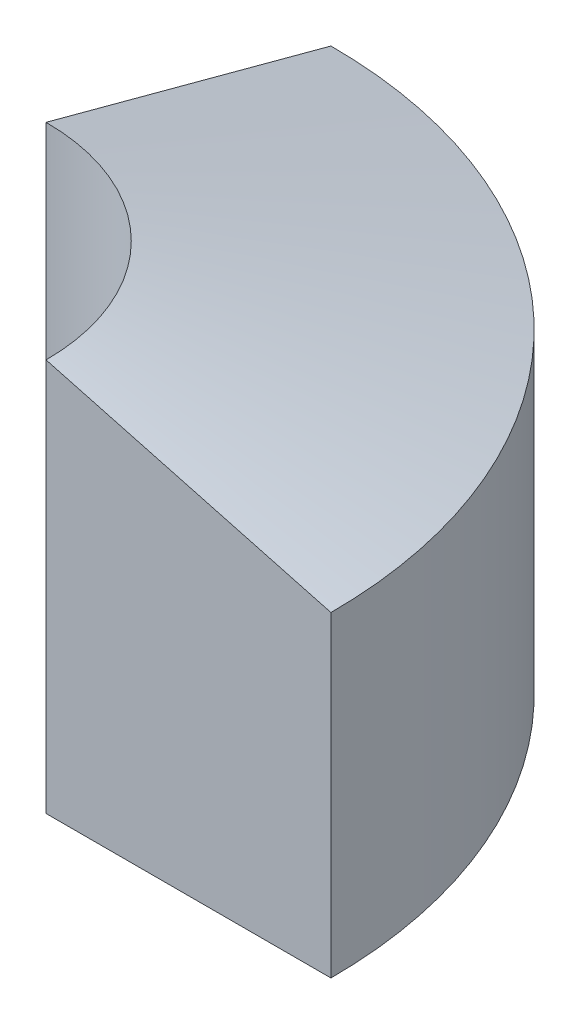
ISO-10303-21;
HEADER;
FILE_DESCRIPTION(('STEP AP214'),'2;1');
FILE_NAME('part.step','',(''),(''),'','','');
FILE_SCHEMA(('AUTOMOTIVE_DESIGN { 1 0 10303 214 1 1 1 1 }'));
ENDSEC;
DATA;
#1=APPLICATION_CONTEXT('core data for automotive mechanical design processes');
#2=APPLICATION_PROTOCOL_DEFINITION('international standard','automotive_design',2000,#1);
#3=PRODUCT_CONTEXT('',#1,'mechanical');
#4=PRODUCT('Part','Part','',(#3));
#5=PRODUCT_RELATED_PRODUCT_CATEGORY('part','',(#4));
#6=PRODUCT_DEFINITION_FORMATION('','',#4);
#7=PRODUCT_DEFINITION_CONTEXT('part definition',#1,'design');
#8=PRODUCT_DEFINITION('design','',#6,#7);
#9=PRODUCT_DEFINITION_SHAPE('','',#8);
#10=(LENGTH_UNIT() NAMED_UNIT(*) SI_UNIT(.MILLI.,.METRE.));
#11=(NAMED_UNIT(*) PLANE_ANGLE_UNIT() SI_UNIT($,.RADIAN.));
#12=(NAMED_UNIT(*) SI_UNIT($,.STERADIAN.) SOLID_ANGLE_UNIT());
#13=UNCERTAINTY_MEASURE_WITH_UNIT(LENGTH_MEASURE(1.E-05),#10,'distance_accuracy_value','');
#14=(GEOMETRIC_REPRESENTATION_CONTEXT(3) GLOBAL_UNCERTAINTY_ASSIGNED_CONTEXT((#13)) GLOBAL_UNIT_ASSIGNED_CONTEXT((#10,
#11,#12)) REPRESENTATION_CONTEXT('',''));
#15=CARTESIAN_POINT('',(0.,0.,0.));
#16=DIRECTION('',(0.,0.,1.));
#17=DIRECTION('',(1.,0.,0.));
#18=AXIS2_PLACEMENT_3D('',#15,#16,#17);
#19=CARTESIAN_POINT('',(13.,12.5,0.));
#20=DIRECTION('',(0.,0.,-1.));
#21=DIRECTION('',(-1.,0.,0.));
#22=AXIS2_PLACEMENT_3D('',#19,#20,#21);
#23=PLANE('',#22);
#24=DIRECTION('',(0.96592582628907,-0.258819045102514,0.));
#25=VECTOR('',#24,1.);
#26=CARTESIAN_POINT('',(31.,7.5,0.));
#27=LINE('',#26,#25);
#28=CARTESIAN_POINT('',(13.,12.3230854637601,0.));
#29=VERTEX_POINT('',#28);
#30=CARTESIAN_POINT('',(31.,7.5,0.));
#31=VERTEX_POINT('',#30);
#32=EDGE_CURVE('E55',#29,#31,#27,.T.);
#33=ORIENTED_EDGE('',*,*,#32,.F.);
#34=DIRECTION('',(0.,-1.,0.));
#35=VECTOR('',#34,1.);
#36=CARTESIAN_POINT('',(13.,12.5,0.));
#37=LINE('',#36,#35);
#38=CARTESIAN_POINT('',(13.,-12.5,0.));
#39=VERTEX_POINT('',#38);
#40=EDGE_CURVE('E11',#29,#39,#37,.T.);
#41=ORIENTED_EDGE('',*,*,#40,.T.);
#42=DIRECTION('',(1.,0.,0.));
#43=VECTOR('',#42,1.);
#44=CARTESIAN_POINT('',(13.,-12.5,0.));
#45=LINE('',#44,#43);
#46=CARTESIAN_POINT('',(31.,-12.5,0.));
#47=VERTEX_POINT('',#46);
#48=EDGE_CURVE('E132',#39,#47,#45,.T.);
#49=ORIENTED_EDGE('',*,*,#48,.T.);
#50=DIRECTION('',(0.,-1.,0.));
#51=VECTOR('',#50,1.);
#52=CARTESIAN_POINT('',(31.,12.5,0.));
#53=LINE('',#52,#51);
#54=EDGE_CURVE('E47',#31,#47,#53,.T.);
#55=ORIENTED_EDGE('',*,*,#54,.F.);
#56=EDGE_LOOP('',(#33,#41,#49,#55));
#57=FACE_BOUND('',#56,.T.);
#58=ADVANCED_FACE('F38',(#57),#23,.F.);
#59=CARTESIAN_POINT('',(0.,12.5,0.));
#60=DIRECTION('',(0.,-1.,0.));
#61=DIRECTION('',(0.,0.,-1.));
#62=AXIS2_PLACEMENT_3D('',#59,#60,#61);
#63=CYLINDRICAL_SURFACE('',#62,13.);
#64=ORIENTED_EDGE('',*,*,#40,.F.);
#65=CARTESIAN_POINT('',(0.,12.3230854637601,0.));
#66=DIRECTION('',(0.,-1.,0.));
#67=DIRECTION('',(0.,0.,-1.));
#68=AXIS2_PLACEMENT_3D('',#65,#66,#67);
#69=CIRCLE('',#68,13.);
#70=CARTESIAN_POINT('',(0.,12.3230854637601,-13.));
#71=VERTEX_POINT('',#70);
#72=EDGE_CURVE('E119',#71,#29,#69,.T.);
#73=ORIENTED_EDGE('',*,*,#72,.F.);
#74=DIRECTION('',(0.,-1.,0.));
#75=VECTOR('',#74,1.);
#76=CARTESIAN_POINT('',(0.,12.5,-13.));
#77=LINE('',#76,#75);
#78=CARTESIAN_POINT('',(0.,-12.5,-13.));
#79=VERTEX_POINT('',#78);
#80=EDGE_CURVE('E63',#71,#79,#77,.T.);
#81=ORIENTED_EDGE('',*,*,#80,.T.);
#82=CARTESIAN_POINT('',(0.,-12.5,0.));
#83=DIRECTION('',(0.,-1.,0.));
#84=DIRECTION('',(0.,0.,-1.));
#85=AXIS2_PLACEMENT_3D('',#82,#83,#84);
#86=CIRCLE('',#85,13.);
#87=EDGE_CURVE('E118',#79,#39,#86,.T.);
#88=ORIENTED_EDGE('',*,*,#87,.T.);
#89=EDGE_LOOP('',(#64,#73,#81,#88));
#90=FACE_BOUND('',#89,.T.);
#91=ADVANCED_FACE('F40',(#90),#63,.F.);
#92=CARTESIAN_POINT('',(0.,12.5,0.));
#93=DIRECTION('',(0.,-1.,0.));
#94=DIRECTION('',(0.,0.,-1.));
#95=AXIS2_PLACEMENT_3D('',#92,#93,#94);
#96=CYLINDRICAL_SURFACE('',#95,31.);
#97=DIRECTION('',(0.,-1.,0.));
#98=VECTOR('',#97,1.);
#99=CARTESIAN_POINT('',(0.,12.5,-31.));
#100=LINE('',#99,#98);
#101=CARTESIAN_POINT('',(0.,7.5,-31.));
#102=VERTEX_POINT('',#101);
#103=CARTESIAN_POINT('',(0.,-12.5,-31.));
#104=VERTEX_POINT('',#103);
#105=EDGE_CURVE('E146',#102,#104,#100,.T.);
#106=ORIENTED_EDGE('',*,*,#105,.F.);
#107=CARTESIAN_POINT('',(0.,7.5,0.));
#108=DIRECTION('',(0.,-1.,0.));
#109=DIRECTION('',(0.,0.,-1.));
#110=AXIS2_PLACEMENT_3D('',#107,#108,#109);
#111=CIRCLE('',#110,31.);
#112=EDGE_CURVE('E116',#102,#31,#111,.T.);
#113=ORIENTED_EDGE('',*,*,#112,.T.);
#114=ORIENTED_EDGE('',*,*,#54,.T.);
#115=CARTESIAN_POINT('',(0.,-12.5,0.));
#116=DIRECTION('',(0.,1.,0.));
#117=DIRECTION('',(0.,0.,-1.));
#118=AXIS2_PLACEMENT_3D('',#115,#116,#117);
#119=CIRCLE('',#118,31.);
#120=EDGE_CURVE('E133',#47,#104,#119,.T.);
#121=ORIENTED_EDGE('',*,*,#120,.T.);
#122=EDGE_LOOP('',(#106,#113,#114,#121));
#123=FACE_BOUND('',#122,.T.);
#124=ADVANCED_FACE('F151',(#123),#96,.T.);
#125=CARTESIAN_POINT('',(0.,12.5,-31.));
#126=DIRECTION('',(1.,0.,0.));
#127=DIRECTION('',(0.,0.,-1.));
#128=AXIS2_PLACEMENT_3D('',#125,#126,#127);
#129=PLANE('',#128);
#130=ORIENTED_EDGE('',*,*,#80,.F.);
#131=DIRECTION('',(0.,-0.258819045102514,-0.96592582628907));
#132=VECTOR('',#131,1.);
#133=CARTESIAN_POINT('',(0.,7.5,-31.));
#134=LINE('',#133,#132);
#135=EDGE_CURVE('E114',#71,#102,#134,.T.);
#136=ORIENTED_EDGE('',*,*,#135,.T.);
#137=ORIENTED_EDGE('',*,*,#105,.T.);
#138=DIRECTION('',(0.,0.,1.));
#139=VECTOR('',#138,1.);
#140=CARTESIAN_POINT('',(0.,-12.5,-31.));
#141=LINE('',#140,#139);
#142=EDGE_CURVE('E138',#104,#79,#141,.T.);
#143=ORIENTED_EDGE('',*,*,#142,.T.);
#144=EDGE_LOOP('',(#130,#136,#137,#143));
#145=FACE_BOUND('',#144,.T.);
#146=ADVANCED_FACE('F155',(#145),#129,.F.);
#147=CARTESIAN_POINT('',(0.,-12.5,0.));
#148=DIRECTION('',(0.,-1.,0.));
#149=DIRECTION('',(0.,0.,-1.));
#150=AXIS2_PLACEMENT_3D('',#147,#148,#149);
#151=PLANE('',#150);
#152=CARTESIAN_POINT('',(6.79837387624872,-12.5,-20.9232433584934));
#153=DIRECTION('',(0.,-1.,0.));
#154=DIRECTION('',(0.,0.,-1.));
#155=AXIS2_PLACEMENT_3D('',#152,#153,#154);
#156=CIRCLE('',#155,3.4);
#157=CARTESIAN_POINT('',(6.79837387624872,-12.5,-24.3232433584934));
#158=VERTEX_POINT('',#157);
#159=EDGE_CURVE('E97',#158,#158,#156,.T.);
#160=ORIENTED_EDGE('',*,*,#159,.F.);
#161=EDGE_LOOP('',(#160));
#162=FACE_BOUND('',#161,.T.);
#163=CARTESIAN_POINT('',(20.9232433584934,-12.5,-6.79837387624886));
#164=DIRECTION('',(0.,-1.,0.));
#165=DIRECTION('',(0.,0.,-1.));
#166=AXIS2_PLACEMENT_3D('',#163,#164,#165);
#167=CIRCLE('',#166,3.4);
#168=CARTESIAN_POINT('',(20.9232433584934,-12.5,-10.1983738762489));
#169=VERTEX_POINT('',#168);
#170=EDGE_CURVE('E96',#169,#169,#167,.T.);
#171=ORIENTED_EDGE('',*,*,#170,.F.);
#172=EDGE_LOOP('',(#171));
#173=FACE_BOUND('',#172,.T.);
#174=ORIENTED_EDGE('',*,*,#87,.F.);
#175=ORIENTED_EDGE('',*,*,#142,.F.);
#176=ORIENTED_EDGE('',*,*,#120,.F.);
#177=ORIENTED_EDGE('',*,*,#48,.F.);
#178=EDGE_LOOP('',(#174,#175,#176,#177));
#179=FACE_BOUND('',#178,.T.);
#180=ADVANCED_FACE('F153',(#162,#173,#179),#151,.T.);
#181=CARTESIAN_POINT('',(0.,12.3230854637601,0.));
#182=DIRECTION('',(0.,-1.,0.));
#183=DIRECTION('',(0.,0.,-1.));
#184=AXIS2_PLACEMENT_3D('',#181,#182,#183);
#185=CONICAL_SURFACE('',#184,13.,1.30899693899575);
#186=ORIENTED_EDGE('',*,*,#135,.F.);
#187=ORIENTED_EDGE('',*,*,#72,.T.);
#188=ORIENTED_EDGE('',*,*,#32,.T.);
#189=ORIENTED_EDGE('',*,*,#112,.F.);
#190=EDGE_LOOP('',(#186,#187,#188,#189));
#191=FACE_BOUND('',#190,.T.);
#192=ADVANCED_FACE('F123',(#191),#185,.T.);
#193=CARTESIAN_POINT('',(20.9232433584934,3.75,-6.79837387624886));
#194=DIRECTION('',(0.,-1.,0.));
#195=DIRECTION('',(0.,0.,-1.));
#196=AXIS2_PLACEMENT_3D('',#193,#194,#195);
#197=CONICAL_SURFACE('',#196,3.4,1.02974425867665);
#198=CARTESIAN_POINT('',(20.9232433584934,5.79292610469371,-6.79837387624886));
#199=VERTEX_POINT('',#198);
#200=VERTEX_LOOP('',#199);
#201=FACE_BOUND('',#200,.T.);
#202=CARTESIAN_POINT('',(20.9232433584934,3.75,-6.79837387624886));
#203=DIRECTION('',(0.,-1.,0.));
#204=DIRECTION('',(0.,0.,-1.));
#205=AXIS2_PLACEMENT_3D('',#202,#203,#204);
#206=CIRCLE('',#205,3.4);
#207=CARTESIAN_POINT('',(20.9232433584934,3.75,-10.1983738762489));
#208=VERTEX_POINT('',#207);
#209=EDGE_CURVE('E100',#208,#208,#206,.T.);
#210=ORIENTED_EDGE('',*,*,#209,.T.);
#211=EDGE_LOOP('',(#210));
#212=FACE_BOUND('',#211,.T.);
#213=ADVANCED_FACE('F189',(#201,#212),#197,.F.);
#214=CARTESIAN_POINT('',(20.9232433584934,-12.5,-6.79837387624886));
#215=DIRECTION('',(0.,-1.,0.));
#216=DIRECTION('',(0.,0.,-1.));
#217=AXIS2_PLACEMENT_3D('',#214,#215,#216);
#218=CYLINDRICAL_SURFACE('',#217,3.4);
#219=ORIENTED_EDGE('',*,*,#209,.F.);
#220=EDGE_LOOP('',(#219));
#221=FACE_BOUND('',#220,.T.);
#222=ORIENTED_EDGE('',*,*,#170,.T.);
#223=EDGE_LOOP('',(#222));
#224=FACE_BOUND('',#223,.T.);
#225=ADVANCED_FACE('F90',(#221,#224),#218,.F.);
#226=CARTESIAN_POINT('',(6.79837387624872,3.75,-20.9232433584934));
#227=DIRECTION('',(0.,-1.,0.));
#228=DIRECTION('',(0.,0.,-1.));
#229=AXIS2_PLACEMENT_3D('',#226,#227,#228);
#230=CONICAL_SURFACE('',#229,3.4,1.02974425867665);
#231=CARTESIAN_POINT('',(6.79837387624871,5.79292610469371,-20.9232433584934));
#232=VERTEX_POINT('',#231);
#233=VERTEX_LOOP('',#232);
#234=FACE_BOUND('',#233,.T.);
#235=CARTESIAN_POINT('',(6.79837387624872,3.75,-20.9232433584934));
#236=DIRECTION('',(0.,-1.,0.));
#237=DIRECTION('',(0.,0.,-1.));
#238=AXIS2_PLACEMENT_3D('',#235,#236,#237);
#239=CIRCLE('',#238,3.4);
#240=CARTESIAN_POINT('',(6.79837387624872,3.75,-24.3232433584934));
#241=VERTEX_POINT('',#240);
#242=EDGE_CURVE('E94',#241,#241,#239,.T.);
#243=ORIENTED_EDGE('',*,*,#242,.T.);
#244=EDGE_LOOP('',(#243));
#245=FACE_BOUND('',#244,.T.);
#246=ADVANCED_FACE('F86',(#234,#245),#230,.F.);
#247=CARTESIAN_POINT('',(6.79837387624872,-12.5,-20.9232433584934));
#248=DIRECTION('',(0.,-1.,0.));
#249=DIRECTION('',(0.,0.,-1.));
#250=AXIS2_PLACEMENT_3D('',#247,#248,#249);
#251=CYLINDRICAL_SURFACE('',#250,3.4);
#252=ORIENTED_EDGE('',*,*,#242,.F.);
#253=EDGE_LOOP('',(#252));
#254=FACE_BOUND('',#253,.T.);
#255=ORIENTED_EDGE('',*,*,#159,.T.);
#256=EDGE_LOOP('',(#255));
#257=FACE_BOUND('',#256,.T.);
#258=ADVANCED_FACE('F89',(#254,#257),#251,.F.);
#259=CLOSED_SHELL('',(#58,#91,#124,#146,#180,#192,#213,#225,#246,#258));
#260=MANIFOLD_SOLID_BREP('B2',#259);
#261=ADVANCED_BREP_SHAPE_REPRESENTATION('',(#18,#260),#14);
#262=SHAPE_DEFINITION_REPRESENTATION(#9,#261);
ENDSEC;
END-ISO-10303-21;
